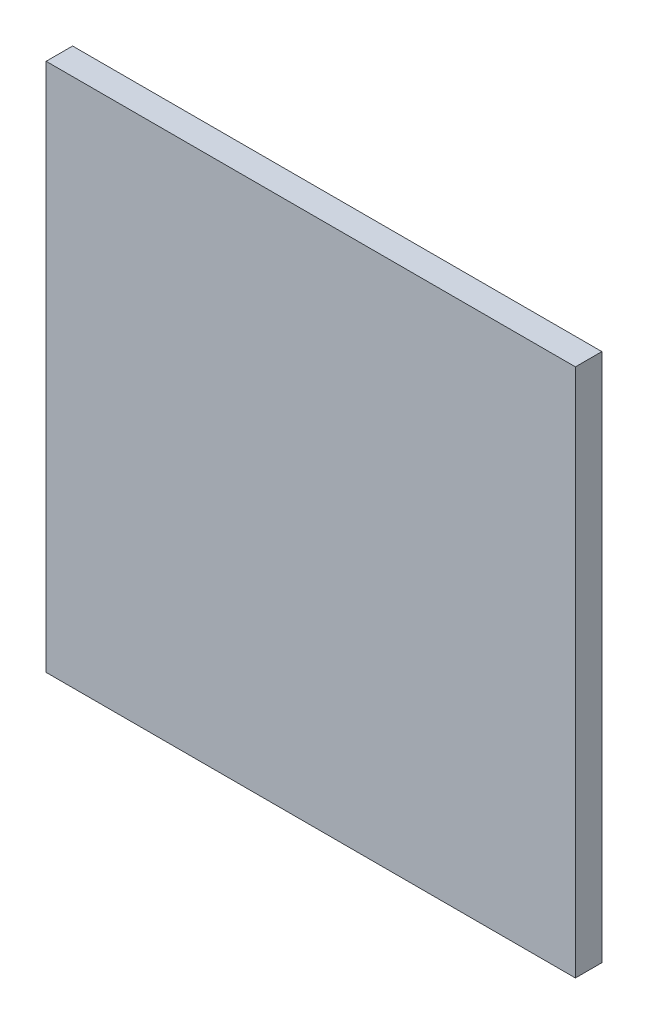
ISO-10303-21;
HEADER;
FILE_DESCRIPTION(('STEP AP214'),'2;1');
FILE_NAME('part.step','',(''),(''),'','','');
FILE_SCHEMA(('AUTOMOTIVE_DESIGN { 1 0 10303 214 1 1 1 1 }'));
ENDSEC;
DATA;
#1=APPLICATION_CONTEXT('core data for automotive mechanical design processes');
#2=APPLICATION_PROTOCOL_DEFINITION('international standard','automotive_design',2000,#1);
#3=PRODUCT_CONTEXT('',#1,'mechanical');
#4=PRODUCT('Part','Part','',(#3));
#5=PRODUCT_RELATED_PRODUCT_CATEGORY('part','',(#4));
#6=PRODUCT_DEFINITION_FORMATION('','',#4);
#7=PRODUCT_DEFINITION_CONTEXT('part definition',#1,'design');
#8=PRODUCT_DEFINITION('design','',#6,#7);
#9=PRODUCT_DEFINITION_SHAPE('','',#8);
#10=(LENGTH_UNIT() NAMED_UNIT(*) SI_UNIT(.MILLI.,.METRE.));
#11=(NAMED_UNIT(*) PLANE_ANGLE_UNIT() SI_UNIT($,.RADIAN.));
#12=(NAMED_UNIT(*) SI_UNIT($,.STERADIAN.) SOLID_ANGLE_UNIT());
#13=UNCERTAINTY_MEASURE_WITH_UNIT(LENGTH_MEASURE(1.E-05),#10,'distance_accuracy_value','');
#14=(GEOMETRIC_REPRESENTATION_CONTEXT(3) GLOBAL_UNCERTAINTY_ASSIGNED_CONTEXT((#13)) GLOBAL_UNIT_ASSIGNED_CONTEXT((#10,
#11,#12)) REPRESENTATION_CONTEXT('',''));
#15=CARTESIAN_POINT('',(0.,0.,0.));
#16=DIRECTION('',(0.,0.,1.));
#17=DIRECTION('',(1.,0.,0.));
#18=AXIS2_PLACEMENT_3D('',#15,#16,#17);
#19=CARTESIAN_POINT('',(-2.,2.,0.2));
#20=DIRECTION('',(1.,0.,0.));
#21=DIRECTION('',(0.,1.,0.));
#22=AXIS2_PLACEMENT_3D('',#19,#20,#21);
#23=PLANE('',#22);
#24=DIRECTION('',(0.,-1.,0.));
#25=VECTOR('',#24,1.);
#26=CARTESIAN_POINT('',(-2.,2.,0.));
#27=LINE('',#26,#25);
#28=CARTESIAN_POINT('',(-2.,2.,0.));
#29=VERTEX_POINT('',#28);
#30=CARTESIAN_POINT('',(-2.,-2.,0.));
#31=VERTEX_POINT('',#30);
#32=EDGE_CURVE('E95',#29,#31,#27,.T.);
#33=ORIENTED_EDGE('',*,*,#32,.T.);
#34=DIRECTION('',(0.,0.,-1.));
#35=VECTOR('',#34,1.);
#36=CARTESIAN_POINT('',(-2.,-2.,0.2));
#37=LINE('',#36,#35);
#38=CARTESIAN_POINT('',(-2.,-2.,0.2));
#39=VERTEX_POINT('',#38);
#40=EDGE_CURVE('E11',#39,#31,#37,.T.);
#41=ORIENTED_EDGE('',*,*,#40,.F.);
#42=DIRECTION('',(0.,-1.,0.));
#43=VECTOR('',#42,1.);
#44=CARTESIAN_POINT('',(-2.,2.,0.2));
#45=LINE('',#44,#43);
#46=CARTESIAN_POINT('',(-2.,2.,0.2));
#47=VERTEX_POINT('',#46);
#48=EDGE_CURVE('E83',#47,#39,#45,.T.);
#49=ORIENTED_EDGE('',*,*,#48,.F.);
#50=DIRECTION('',(0.,0.,-1.));
#51=VECTOR('',#50,1.);
#52=CARTESIAN_POINT('',(-2.,2.,0.2));
#53=LINE('',#52,#51);
#54=EDGE_CURVE('E91',#47,#29,#53,.T.);
#55=ORIENTED_EDGE('',*,*,#54,.T.);
#56=EDGE_LOOP('',(#33,#41,#49,#55));
#57=FACE_BOUND('',#56,.T.);
#58=ADVANCED_FACE('F32',(#57),#23,.F.);
#59=CARTESIAN_POINT('',(-2.,-2.,0.2));
#60=DIRECTION('',(0.,1.,0.));
#61=DIRECTION('',(0.,0.,1.));
#62=AXIS2_PLACEMENT_3D('',#59,#60,#61);
#63=PLANE('',#62);
#64=DIRECTION('',(1.,0.,0.));
#65=VECTOR('',#64,1.);
#66=CARTESIAN_POINT('',(-2.,-2.,0.));
#67=LINE('',#66,#65);
#68=CARTESIAN_POINT('',(2.,-2.,0.));
#69=VERTEX_POINT('',#68);
#70=EDGE_CURVE('E87',#31,#69,#67,.T.);
#71=ORIENTED_EDGE('',*,*,#70,.T.);
#72=DIRECTION('',(0.,0.,-1.));
#73=VECTOR('',#72,1.);
#74=CARTESIAN_POINT('',(2.,-2.,0.2));
#75=LINE('',#74,#73);
#76=CARTESIAN_POINT('',(2.,-2.,0.2));
#77=VERTEX_POINT('',#76);
#78=EDGE_CURVE('E40',#77,#69,#75,.T.);
#79=ORIENTED_EDGE('',*,*,#78,.F.);
#80=DIRECTION('',(1.,0.,0.));
#81=VECTOR('',#80,1.);
#82=CARTESIAN_POINT('',(-2.,-2.,0.2));
#83=LINE('',#82,#81);
#84=EDGE_CURVE('E78',#39,#77,#83,.T.);
#85=ORIENTED_EDGE('',*,*,#84,.F.);
#86=ORIENTED_EDGE('',*,*,#40,.T.);
#87=EDGE_LOOP('',(#71,#79,#85,#86));
#88=FACE_BOUND('',#87,.T.);
#89=ADVANCED_FACE('F86',(#88),#63,.F.);
#90=CARTESIAN_POINT('',(2.,2.,0.2));
#91=DIRECTION('',(-1.,0.,0.));
#92=DIRECTION('',(0.,-1.,0.));
#93=AXIS2_PLACEMENT_3D('',#90,#91,#92);
#94=PLANE('',#93);
#95=DIRECTION('',(0.,1.,0.));
#96=VECTOR('',#95,1.);
#97=CARTESIAN_POINT('',(2.,2.,0.));
#98=LINE('',#97,#96);
#99=CARTESIAN_POINT('',(2.,2.,0.));
#100=VERTEX_POINT('',#99);
#101=EDGE_CURVE('E65',#69,#100,#98,.T.);
#102=ORIENTED_EDGE('',*,*,#101,.T.);
#103=DIRECTION('',(0.,0.,-1.));
#104=VECTOR('',#103,1.);
#105=CARTESIAN_POINT('',(2.,2.,0.2));
#106=LINE('',#105,#104);
#107=CARTESIAN_POINT('',(2.,2.,0.2));
#108=VERTEX_POINT('',#107);
#109=EDGE_CURVE('E88',#108,#100,#106,.T.);
#110=ORIENTED_EDGE('',*,*,#109,.F.);
#111=DIRECTION('',(0.,1.,0.));
#112=VECTOR('',#111,1.);
#113=CARTESIAN_POINT('',(2.,2.,0.2));
#114=LINE('',#113,#112);
#115=EDGE_CURVE('E81',#77,#108,#114,.T.);
#116=ORIENTED_EDGE('',*,*,#115,.F.);
#117=ORIENTED_EDGE('',*,*,#78,.T.);
#118=EDGE_LOOP('',(#102,#110,#116,#117));
#119=FACE_BOUND('',#118,.T.);
#120=ADVANCED_FACE('F89',(#119),#94,.F.);
#121=CARTESIAN_POINT('',(-2.,2.,0.2));
#122=DIRECTION('',(0.,-1.,0.));
#123=DIRECTION('',(0.,0.,-1.));
#124=AXIS2_PLACEMENT_3D('',#121,#122,#123);
#125=PLANE('',#124);
#126=DIRECTION('',(-1.,0.,0.));
#127=VECTOR('',#126,1.);
#128=CARTESIAN_POINT('',(-2.,2.,0.));
#129=LINE('',#128,#127);
#130=EDGE_CURVE('E71',#100,#29,#129,.T.);
#131=ORIENTED_EDGE('',*,*,#130,.T.);
#132=ORIENTED_EDGE('',*,*,#54,.F.);
#133=DIRECTION('',(-1.,0.,0.));
#134=VECTOR('',#133,1.);
#135=CARTESIAN_POINT('',(-2.,2.,0.2));
#136=LINE('',#135,#134);
#137=EDGE_CURVE('E48',#108,#47,#136,.T.);
#138=ORIENTED_EDGE('',*,*,#137,.F.);
#139=ORIENTED_EDGE('',*,*,#109,.T.);
#140=EDGE_LOOP('',(#131,#132,#138,#139));
#141=FACE_BOUND('',#140,.T.);
#142=ADVANCED_FACE('F102',(#141),#125,.F.);
#143=CARTESIAN_POINT('',(-2.,-2.,0.2));
#144=DIRECTION('',(0.,0.,1.));
#145=DIRECTION('',(1.,0.,0.));
#146=AXIS2_PLACEMENT_3D('',#143,#144,#145);
#147=PLANE('',#146);
#148=ORIENTED_EDGE('',*,*,#48,.T.);
#149=ORIENTED_EDGE('',*,*,#84,.T.);
#150=ORIENTED_EDGE('',*,*,#115,.T.);
#151=ORIENTED_EDGE('',*,*,#137,.T.);
#152=EDGE_LOOP('',(#148,#149,#150,#151));
#153=FACE_BOUND('',#152,.T.);
#154=ADVANCED_FACE('F79',(#153),#147,.T.);
#155=CARTESIAN_POINT('',(-2.,-2.,0.));
#156=DIRECTION('',(0.,0.,1.));
#157=DIRECTION('',(1.,0.,0.));
#158=AXIS2_PLACEMENT_3D('',#155,#156,#157);
#159=PLANE('',#158);
#160=ORIENTED_EDGE('',*,*,#32,.F.);
#161=ORIENTED_EDGE('',*,*,#130,.F.);
#162=ORIENTED_EDGE('',*,*,#101,.F.);
#163=ORIENTED_EDGE('',*,*,#70,.F.);
#164=EDGE_LOOP('',(#160,#161,#162,#163));
#165=FACE_BOUND('',#164,.T.);
#166=ADVANCED_FACE('F105',(#165),#159,.F.);
#167=CLOSED_SHELL('',(#58,#89,#120,#142,#154,#166));
#168=MANIFOLD_SOLID_BREP('B2',#167);
#169=ADVANCED_BREP_SHAPE_REPRESENTATION('',(#18,#168),#14);
#170=SHAPE_DEFINITION_REPRESENTATION(#9,#169);
ENDSEC;
END-ISO-10303-21;
